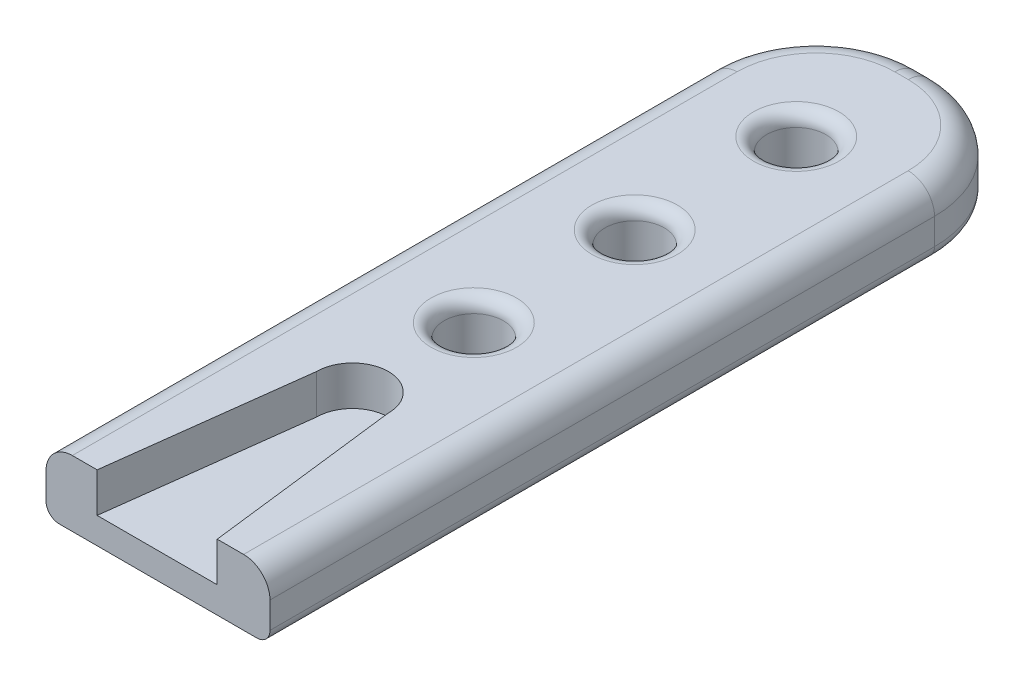
ISO-10303-21;
HEADER;
FILE_DESCRIPTION(('STEP AP214'),'2;1');
FILE_NAME('part.step','',(''),(''),'','','');
FILE_SCHEMA(('AUTOMOTIVE_DESIGN { 1 0 10303 214 1 1 1 1 }'));
ENDSEC;
DATA;
#1=APPLICATION_CONTEXT('core data for automotive mechanical design processes');
#2=APPLICATION_PROTOCOL_DEFINITION('international standard','automotive_design',2000,#1);
#3=PRODUCT_CONTEXT('',#1,'mechanical');
#4=PRODUCT('Part','Part','',(#3));
#5=PRODUCT_RELATED_PRODUCT_CATEGORY('part','',(#4));
#6=PRODUCT_DEFINITION_FORMATION('','',#4);
#7=PRODUCT_DEFINITION_CONTEXT('part definition',#1,'design');
#8=PRODUCT_DEFINITION('design','',#6,#7);
#9=PRODUCT_DEFINITION_SHAPE('','',#8);
#10=(LENGTH_UNIT() NAMED_UNIT(*) SI_UNIT(.MILLI.,.METRE.));
#11=(NAMED_UNIT(*) PLANE_ANGLE_UNIT() SI_UNIT($,.RADIAN.));
#12=(NAMED_UNIT(*) SI_UNIT($,.STERADIAN.) SOLID_ANGLE_UNIT());
#13=UNCERTAINTY_MEASURE_WITH_UNIT(LENGTH_MEASURE(1.E-05),#10,'distance_accuracy_value','');
#14=(GEOMETRIC_REPRESENTATION_CONTEXT(3) GLOBAL_UNCERTAINTY_ASSIGNED_CONTEXT((#13)) GLOBAL_UNIT_ASSIGNED_CONTEXT((#10,
#11,#12)) REPRESENTATION_CONTEXT('',''));
#15=CARTESIAN_POINT('',(0.,0.,0.));
#16=DIRECTION('',(0.,0.,1.));
#17=DIRECTION('',(1.,0.,0.));
#18=AXIS2_PLACEMENT_3D('',#15,#16,#17);
#19=CARTESIAN_POINT('',(-8.63704065750773,2.,0.));
#20=DIRECTION('',(1.,0.,0.));
#21=DIRECTION('',(0.,0.,-1.));
#22=AXIS2_PLACEMENT_3D('',#19,#20,#21);
#23=PLANE('',#22);
#24=DIRECTION('',(0.,-1.,0.));
#25=VECTOR('',#24,1.);
#26=CARTESIAN_POINT('',(-8.63704065750773,0.,-2.55421433247077));
#27=LINE('',#26,#25);
#28=CARTESIAN_POINT('',(-8.63704065750773,3.,-2.55421433247077));
#29=VERTEX_POINT('',#28);
#30=CARTESIAN_POINT('',(-8.63704065750773,1.,-2.55421433247077));
#31=VERTEX_POINT('',#30);
#32=EDGE_CURVE('E208',#29,#31,#27,.T.);
#33=ORIENTED_EDGE('',*,*,#32,.T.);
#34=DIRECTION('',(0.,0.,1.));
#35=VECTOR('',#34,1.);
#36=CARTESIAN_POINT('',(-8.63704065750773,1.,0.));
#37=LINE('',#36,#35);
#38=CARTESIAN_POINT('',(-8.63704065750773,1.,47.9450292444032));
#39=VERTEX_POINT('',#38);
#40=EDGE_CURVE('E288',#31,#39,#37,.T.);
#41=ORIENTED_EDGE('',*,*,#40,.T.);
#42=DIRECTION('',(0.,-1.,0.));
#43=VECTOR('',#42,1.);
#44=CARTESIAN_POINT('',(-8.63704065750773,2.,47.9450292444032));
#45=LINE('',#44,#43);
#46=CARTESIAN_POINT('',(-8.63704065750773,3.,47.9450292444032));
#47=VERTEX_POINT('',#46);
#48=EDGE_CURVE('E205',#47,#39,#45,.T.);
#49=ORIENTED_EDGE('',*,*,#48,.F.);
#50=DIRECTION('',(0.,0.,1.));
#51=VECTOR('',#50,1.);
#52=CARTESIAN_POINT('',(-8.63704065750773,3.,-2.55421433247077));
#53=LINE('',#52,#51);
#54=EDGE_CURVE('E242',#47,#29,#53,.F.);
#55=ORIENTED_EDGE('',*,*,#54,.T.);
#56=EDGE_LOOP('',(#33,#41,#49,#55));
#57=FACE_BOUND('',#56,.T.);
#58=ADVANCED_FACE('F35',(#57),#23,.F.);
#59=CARTESIAN_POINT('',(0.,2.,47.9450292444032));
#60=DIRECTION('',(0.,0.,-1.));
#61=DIRECTION('',(-1.,0.,0.));
#62=AXIS2_PLACEMENT_3D('',#59,#60,#61);
#63=PLANE('',#62);
#64=ORIENTED_EDGE('',*,*,#48,.T.);
#65=CARTESIAN_POINT('',(-7.63704065750773,1.,47.9450292444032));
#66=DIRECTION('',(0.,0.,-1.));
#67=DIRECTION('',(-1.,0.,0.));
#68=AXIS2_PLACEMENT_3D('',#65,#66,#67);
#69=CIRCLE('',#68,1.);
#70=CARTESIAN_POINT('',(-7.63704065750773,0.,47.9450292444032));
#71=VERTEX_POINT('',#70);
#72=EDGE_CURVE('E293',#39,#71,#69,.F.);
#73=ORIENTED_EDGE('',*,*,#72,.T.);
#74=DIRECTION('',(1.,0.,0.));
#75=VECTOR('',#74,1.);
#76=CARTESIAN_POINT('',(0.,0.,47.9450292444032));
#77=LINE('',#76,#75);
#78=CARTESIAN_POINT('',(7.38068932213508,0.,47.9450292444032));
#79=VERTEX_POINT('',#78);
#80=EDGE_CURVE('E198',#71,#79,#77,.T.);
#81=ORIENTED_EDGE('',*,*,#80,.T.);
#82=CARTESIAN_POINT('',(7.38068932213508,1.,47.9450292444032));
#83=DIRECTION('',(0.,0.,-1.));
#84=DIRECTION('',(-1.,0.,0.));
#85=AXIS2_PLACEMENT_3D('',#82,#83,#84);
#86=CIRCLE('',#85,1.);
#87=CARTESIAN_POINT('',(8.38068932213508,1.,47.9450292444032));
#88=VERTEX_POINT('',#87);
#89=EDGE_CURVE('E291',#79,#88,#86,.F.);
#90=ORIENTED_EDGE('',*,*,#89,.T.);
#91=DIRECTION('',(0.,-1.,0.));
#92=VECTOR('',#91,1.);
#93=CARTESIAN_POINT('',(8.38068932213508,2.,47.9450292444032));
#94=LINE('',#93,#92);
#95=CARTESIAN_POINT('',(8.38068932213508,3.,47.9450292444032));
#96=VERTEX_POINT('',#95);
#97=EDGE_CURVE('E201',#96,#88,#94,.T.);
#98=ORIENTED_EDGE('',*,*,#97,.F.);
#99=CARTESIAN_POINT('',(6.38068932213508,3.,47.9450292444032));
#100=DIRECTION('',(0.,0.,-1.));
#101=DIRECTION('',(-1.,0.,0.));
#102=AXIS2_PLACEMENT_3D('',#99,#100,#101);
#103=CIRCLE('',#102,2.);
#104=CARTESIAN_POINT('',(6.38068932213508,5.,47.9450292444032));
#105=VERTEX_POINT('',#104);
#106=EDGE_CURVE('E222',#96,#105,#103,.F.);
#107=ORIENTED_EDGE('',*,*,#106,.T.);
#108=DIRECTION('',(1.,0.,0.));
#109=VECTOR('',#108,1.);
#110=CARTESIAN_POINT('',(0.,5.,47.9450292444032));
#111=LINE('',#110,#109);
#112=CARTESIAN_POINT('',(4.37216869664136,5.,47.9450292444032));
#113=VERTEX_POINT('',#112);
#114=EDGE_CURVE('E184',#113,#105,#111,.T.);
#115=ORIENTED_EDGE('',*,*,#114,.F.);
#116=DIRECTION('',(0.,-1.,0.));
#117=VECTOR('',#116,1.);
#118=CARTESIAN_POINT('',(4.37216869664136,5.,47.9450292444032));
#119=LINE('',#118,#117);
#120=CARTESIAN_POINT('',(4.37216869664136,2.,47.9450292444032));
#121=VERTEX_POINT('',#120);
#122=EDGE_CURVE('E189',#113,#121,#119,.T.);
#123=ORIENTED_EDGE('',*,*,#122,.T.);
#124=DIRECTION('',(1.,0.,0.));
#125=VECTOR('',#124,1.);
#126=CARTESIAN_POINT('',(0.,2.,47.9450292444032));
#127=LINE('',#126,#125);
#128=CARTESIAN_POINT('',(-4.75197531295416,2.,47.9450292444032));
#129=VERTEX_POINT('',#128);
#130=EDGE_CURVE('E199',#129,#121,#127,.T.);
#131=ORIENTED_EDGE('',*,*,#130,.F.);
#132=DIRECTION('',(0.,-1.,0.));
#133=VECTOR('',#132,1.);
#134=CARTESIAN_POINT('',(-4.75197531295416,5.,47.9450292444032));
#135=LINE('',#134,#133);
#136=CARTESIAN_POINT('',(-4.75197531295416,5.,47.9450292444032));
#137=VERTEX_POINT('',#136);
#138=EDGE_CURVE('E187',#137,#129,#135,.T.);
#139=ORIENTED_EDGE('',*,*,#138,.F.);
#140=DIRECTION('',(1.,0.,0.));
#141=VECTOR('',#140,1.);
#142=CARTESIAN_POINT('',(0.,5.,47.9450292444032));
#143=LINE('',#142,#141);
#144=CARTESIAN_POINT('',(-6.63704065750773,5.,47.9450292444032));
#145=VERTEX_POINT('',#144);
#146=EDGE_CURVE('E175',#145,#137,#143,.T.);
#147=ORIENTED_EDGE('',*,*,#146,.F.);
#148=CARTESIAN_POINT('',(-6.63704065750773,3.,47.9450292444032));
#149=DIRECTION('',(0.,0.,-1.));
#150=DIRECTION('',(-1.,0.,0.));
#151=AXIS2_PLACEMENT_3D('',#148,#149,#150);
#152=CIRCLE('',#151,2.);
#153=EDGE_CURVE('E220',#145,#47,#152,.F.);
#154=ORIENTED_EDGE('',*,*,#153,.T.);
#155=EDGE_LOOP('',(#64,#73,#81,#90,#98,#107,#115,#123,#131,#139,#147,#154));
#156=FACE_BOUND('',#155,.T.);
#157=ADVANCED_FACE('F334',(#156),#63,.F.);
#158=CARTESIAN_POINT('',(8.38068932213508,2.,0.));
#159=DIRECTION('',(1.,0.,0.));
#160=DIRECTION('',(0.,0.,-1.));
#161=AXIS2_PLACEMENT_3D('',#158,#159,#160);
#162=PLANE('',#161);
#163=ORIENTED_EDGE('',*,*,#97,.T.);
#164=DIRECTION('',(0.,0.,1.));
#165=VECTOR('',#164,1.);
#166=CARTESIAN_POINT('',(8.38068932213508,1.,-2.55421433247077));
#167=LINE('',#166,#165);
#168=CARTESIAN_POINT('',(8.38068932213508,1.,-2.55421433247077));
#169=VERTEX_POINT('',#168);
#170=EDGE_CURVE('E11',#88,#169,#167,.F.);
#171=ORIENTED_EDGE('',*,*,#170,.T.);
#172=DIRECTION('',(0.,-1.,0.));
#173=VECTOR('',#172,1.);
#174=CARTESIAN_POINT('',(8.38068932213508,2.,-2.55421433247077));
#175=LINE('',#174,#173);
#176=CARTESIAN_POINT('',(8.38068932213508,3.,-2.55421433247077));
#177=VERTEX_POINT('',#176);
#178=EDGE_CURVE('E215',#169,#177,#175,.F.);
#179=ORIENTED_EDGE('',*,*,#178,.T.);
#180=DIRECTION('',(0.,0.,1.));
#181=VECTOR('',#180,1.);
#182=CARTESIAN_POINT('',(8.38068932213508,3.,0.));
#183=LINE('',#182,#181);
#184=EDGE_CURVE('E217',#177,#96,#183,.T.);
#185=ORIENTED_EDGE('',*,*,#184,.T.);
#186=EDGE_LOOP('',(#163,#171,#179,#185));
#187=FACE_BOUND('',#186,.T.);
#188=ADVANCED_FACE('F376',(#187),#162,.T.);
#189=CARTESIAN_POINT('',(-0.128409056114503,2.,11.7214834272454));
#190=DIRECTION('',(0.,-1.,0.));
#191=DIRECTION('',(0.,0.,-1.));
#192=AXIS2_PLACEMENT_3D('',#189,#190,#191);
#193=CYLINDRICAL_SURFACE('',#192,2.24999999887289);
#194=CARTESIAN_POINT('',(-0.128409056114503,1.,11.7214834272454));
#195=DIRECTION('',(0.,1.,0.));
#196=DIRECTION('',(0.,0.,1.));
#197=AXIS2_PLACEMENT_3D('',#194,#195,#196);
#198=CIRCLE('',#197,2.24999999887289);
#199=CARTESIAN_POINT('',(-0.128409056114503,1.,13.9714834261183));
#200=VERTEX_POINT('',#199);
#201=EDGE_CURVE('E270',#200,#200,#198,.F.);
#202=ORIENTED_EDGE('',*,*,#201,.T.);
#203=EDGE_LOOP('',(#202));
#204=FACE_BOUND('',#203,.T.);
#205=CARTESIAN_POINT('',(-0.128409056114503,4.,11.7214834272454));
#206=DIRECTION('',(0.,1.,0.));
#207=DIRECTION('',(0.,0.,1.));
#208=AXIS2_PLACEMENT_3D('',#205,#206,#207);
#209=CIRCLE('',#208,2.24999999887289);
#210=CARTESIAN_POINT('',(-0.128409056114503,4.,13.9714834261183));
#211=VERTEX_POINT('',#210);
#212=EDGE_CURVE('E267',#211,#211,#209,.T.);
#213=ORIENTED_EDGE('',*,*,#212,.T.);
#214=EDGE_LOOP('',(#213));
#215=FACE_BOUND('',#214,.T.);
#216=ADVANCED_FACE('F558',(#204,#215),#193,.F.);
#217=CARTESIAN_POINT('',(-0.1283831302215,2.,23.9474470096946));
#218=DIRECTION('',(0.,-1.,0.));
#219=DIRECTION('',(0.,0.,-1.));
#220=AXIS2_PLACEMENT_3D('',#217,#218,#219);
#221=CYLINDRICAL_SURFACE('',#220,2.25);
#222=CARTESIAN_POINT('',(-0.1283831302215,1.,23.9474470096946));
#223=DIRECTION('',(0.,1.,0.));
#224=DIRECTION('',(0.,0.,1.));
#225=AXIS2_PLACEMENT_3D('',#222,#223,#224);
#226=CIRCLE('',#225,2.25);
#227=CARTESIAN_POINT('',(-0.1283831302215,1.,26.1974470096946));
#228=VERTEX_POINT('',#227);
#229=EDGE_CURVE('E264',#228,#228,#226,.F.);
#230=ORIENTED_EDGE('',*,*,#229,.T.);
#231=EDGE_LOOP('',(#230));
#232=FACE_BOUND('',#231,.T.);
#233=CARTESIAN_POINT('',(-0.1283831302215,4.,23.9474470096946));
#234=DIRECTION('',(0.,1.,0.));
#235=DIRECTION('',(0.,0.,1.));
#236=AXIS2_PLACEMENT_3D('',#233,#234,#235);
#237=CIRCLE('',#236,2.25);
#238=CARTESIAN_POINT('',(-0.1283831302215,4.,26.1974470096946));
#239=VERTEX_POINT('',#238);
#240=EDGE_CURVE('E261',#239,#239,#237,.T.);
#241=ORIENTED_EDGE('',*,*,#240,.T.);
#242=EDGE_LOOP('',(#241));
#243=FACE_BOUND('',#242,.T.);
#244=ADVANCED_FACE('F546',(#232,#243),#221,.F.);
#245=CARTESIAN_POINT('',(0.,2.,-10.5542143324708));
#246=DIRECTION('',(0.,0.,-1.));
#247=DIRECTION('',(-1.,0.,0.));
#248=AXIS2_PLACEMENT_3D('',#245,#246,#247);
#249=PLANE('',#248);
#250=DIRECTION('',(0.,-1.,0.));
#251=VECTOR('',#250,1.);
#252=CARTESIAN_POINT('',(0.380689322135079,2.,-10.5542143324708));
#253=LINE('',#252,#251);
#254=CARTESIAN_POINT('',(0.380689322135079,3.,-10.5542143324708));
#255=VERTEX_POINT('',#254);
#256=CARTESIAN_POINT('',(0.380689322135079,1.,-10.5542143324708));
#257=VERTEX_POINT('',#256);
#258=EDGE_CURVE('E211',#255,#257,#253,.T.);
#259=ORIENTED_EDGE('',*,*,#258,.T.);
#260=DIRECTION('',(1.,0.,0.));
#261=VECTOR('',#260,1.);
#262=CARTESIAN_POINT('',(-0.637040657507733,1.,-10.5542143324708));
#263=LINE('',#262,#261);
#264=CARTESIAN_POINT('',(-0.637040657507733,1.,-10.5542143324708));
#265=VERTEX_POINT('',#264);
#266=EDGE_CURVE('E307',#257,#265,#263,.F.);
#267=ORIENTED_EDGE('',*,*,#266,.T.);
#268=DIRECTION('',(0.,-1.,0.));
#269=VECTOR('',#268,1.);
#270=CARTESIAN_POINT('',(-0.637040657507733,5.,-10.5542143324708));
#271=LINE('',#270,#269);
#272=CARTESIAN_POINT('',(-0.637040657507733,3.,-10.5542143324708));
#273=VERTEX_POINT('',#272);
#274=EDGE_CURVE('E213',#265,#273,#271,.F.);
#275=ORIENTED_EDGE('',*,*,#274,.T.);
#276=DIRECTION('',(1.,0.,0.));
#277=VECTOR('',#276,1.);
#278=CARTESIAN_POINT('',(0.,3.,-10.5542143324708));
#279=LINE('',#278,#277);
#280=EDGE_CURVE('E237',#273,#255,#279,.T.);
#281=ORIENTED_EDGE('',*,*,#280,.T.);
#282=EDGE_LOOP('',(#259,#267,#275,#281));
#283=FACE_BOUND('',#282,.T.);
#284=ADVANCED_FACE('F354',(#283),#249,.T.);
#285=CARTESIAN_POINT('',(-0.128292361900419,2.,-0.554214332238324));
#286=DIRECTION('',(0.,-1.,0.));
#287=DIRECTION('',(0.,0.,-1.));
#288=AXIS2_PLACEMENT_3D('',#285,#286,#287);
#289=CYLINDRICAL_SURFACE('',#288,2.25);
#290=CARTESIAN_POINT('',(-0.128292361900419,1.,-0.554214332238324));
#291=DIRECTION('',(0.,1.,0.));
#292=DIRECTION('',(0.,0.,1.));
#293=AXIS2_PLACEMENT_3D('',#290,#291,#292);
#294=CIRCLE('',#293,2.25);
#295=CARTESIAN_POINT('',(-0.128292361900419,1.,1.69578566776168));
#296=VERTEX_POINT('',#295);
#297=EDGE_CURVE('E276',#296,#296,#294,.F.);
#298=ORIENTED_EDGE('',*,*,#297,.T.);
#299=EDGE_LOOP('',(#298));
#300=FACE_BOUND('',#299,.T.);
#301=CARTESIAN_POINT('',(-0.128292361900419,4.,-0.554214332238324));
#302=DIRECTION('',(0.,1.,0.));
#303=DIRECTION('',(0.,0.,1.));
#304=AXIS2_PLACEMENT_3D('',#301,#302,#303);
#305=CIRCLE('',#304,2.25);
#306=CARTESIAN_POINT('',(-0.128292361900419,4.,1.69578566776168));
#307=VERTEX_POINT('',#306);
#308=EDGE_CURVE('E273',#307,#307,#305,.T.);
#309=ORIENTED_EDGE('',*,*,#308,.T.);
#310=EDGE_LOOP('',(#309));
#311=FACE_BOUND('',#310,.T.);
#312=ADVANCED_FACE('F383',(#300,#311),#289,.F.);
#313=CARTESIAN_POINT('',(0.,2.,0.));
#314=DIRECTION('',(0.,1.,0.));
#315=DIRECTION('',(0.,0.,1.));
#316=AXIS2_PLACEMENT_3D('',#313,#314,#315);
#317=PLANE('',#316);
#318=DIRECTION('',(0.124934588841006,0.,-0.992164980490205));
#319=VECTOR('',#318,1.);
#320=CARTESIAN_POINT('',(1.26525742098557,2.,0.15932271222752));
#321=LINE('',#320,#319);
#322=CARTESIAN_POINT('',(-2.88708064032051,2.,33.1350138303006));
#323=VERTEX_POINT('',#322);
#324=EDGE_CURVE('E157',#129,#323,#321,.T.);
#325=ORIENTED_EDGE('',*,*,#324,.F.);
#326=ORIENTED_EDGE('',*,*,#130,.T.);
#327=DIRECTION('',(0.120618857284149,0.,0.992698892548726));
#328=VECTOR('',#327,1.);
#329=CARTESIAN_POINT('',(-1.43229337725956,2.,0.174032218387131));
#330=LINE('',#329,#328);
#331=CARTESIAN_POINT('',(2.57347965168719,2.,33.1417334482974));
#332=VERTEX_POINT('',#331);
#333=EDGE_CURVE('E160',#332,#121,#330,.T.);
#334=ORIENTED_EDGE('',*,*,#333,.F.);
#335=CARTESIAN_POINT('',(-0.156800494316656,2.,33.138373639299));
#336=DIRECTION('',(0.,1.,0.));
#337=DIRECTION('',(0.,0.,1.));
#338=AXIS2_PLACEMENT_3D('',#335,#336,#337);
#339=CIRCLE('',#338,2.73028221324817);
#340=EDGE_CURVE('E195',#332,#323,#339,.T.);
#341=ORIENTED_EDGE('',*,*,#340,.T.);
#342=EDGE_LOOP('',(#325,#326,#334,#341));
#343=FACE_BOUND('',#342,.T.);
#344=ADVANCED_FACE('F381',(#343),#317,.T.);
#345=CARTESIAN_POINT('',(0.,0.,0.));
#346=DIRECTION('',(0.,1.,0.));
#347=DIRECTION('',(0.,0.,1.));
#348=AXIS2_PLACEMENT_3D('',#345,#346,#347);
#349=PLANE('',#348);
#350=CARTESIAN_POINT('',(-0.1283831302215,0.,23.9474470096946));
#351=DIRECTION('',(0.,1.,0.));
#352=DIRECTION('',(0.,0.,1.));
#353=AXIS2_PLACEMENT_3D('',#350,#351,#352);
#354=CIRCLE('',#353,3.25);
#355=CARTESIAN_POINT('',(-0.1283831302215,0.,27.1974470096946));
#356=VERTEX_POINT('',#355);
#357=EDGE_CURVE('E258',#356,#356,#354,.T.);
#358=ORIENTED_EDGE('',*,*,#357,.T.);
#359=EDGE_LOOP('',(#358));
#360=FACE_BOUND('',#359,.T.);
#361=CARTESIAN_POINT('',(-0.128409056114503,0.,11.7214834272454));
#362=DIRECTION('',(0.,1.,0.));
#363=DIRECTION('',(0.,0.,1.));
#364=AXIS2_PLACEMENT_3D('',#361,#362,#363);
#365=CIRCLE('',#364,3.24999999887289);
#366=CARTESIAN_POINT('',(-0.128409056114503,0.,14.9714834261183));
#367=VERTEX_POINT('',#366);
#368=EDGE_CURVE('E255',#367,#367,#365,.T.);
#369=ORIENTED_EDGE('',*,*,#368,.T.);
#370=EDGE_LOOP('',(#369));
#371=FACE_BOUND('',#370,.T.);
#372=CARTESIAN_POINT('',(-0.128292361900419,0.,-0.554214332238324));
#373=DIRECTION('',(0.,1.,0.));
#374=DIRECTION('',(0.,0.,1.));
#375=AXIS2_PLACEMENT_3D('',#372,#373,#374);
#376=CIRCLE('',#375,3.25);
#377=CARTESIAN_POINT('',(-0.128292361900419,0.,2.69578566776168));
#378=VERTEX_POINT('',#377);
#379=EDGE_CURVE('E244',#378,#378,#376,.T.);
#380=ORIENTED_EDGE('',*,*,#379,.T.);
#381=EDGE_LOOP('',(#380));
#382=FACE_BOUND('',#381,.T.);
#383=ORIENTED_EDGE('',*,*,#80,.F.);
#384=DIRECTION('',(0.,0.,1.));
#385=VECTOR('',#384,1.);
#386=CARTESIAN_POINT('',(-7.63704065750773,0.,0.));
#387=LINE('',#386,#385);
#388=CARTESIAN_POINT('',(-7.63704065750773,0.,-2.55421433247077));
#389=VERTEX_POINT('',#388);
#390=EDGE_CURVE('E303',#71,#389,#387,.F.);
#391=ORIENTED_EDGE('',*,*,#390,.T.);
#392=CARTESIAN_POINT('',(-0.637040657507733,0.,-2.55421433247077));
#393=DIRECTION('',(0.,1.,0.));
#394=DIRECTION('',(0.,0.,1.));
#395=AXIS2_PLACEMENT_3D('',#392,#393,#394);
#396=CIRCLE('',#395,7.);
#397=CARTESIAN_POINT('',(-0.637040657507733,0.,-9.55421433247077));
#398=VERTEX_POINT('',#397);
#399=EDGE_CURVE('E301',#389,#398,#396,.F.);
#400=ORIENTED_EDGE('',*,*,#399,.T.);
#401=DIRECTION('',(1.,0.,0.));
#402=VECTOR('',#401,1.);
#403=CARTESIAN_POINT('',(0.380689322135079,0.,-9.55421433247077));
#404=LINE('',#403,#402);
#405=CARTESIAN_POINT('',(0.380689322135079,0.,-9.55421433247077));
#406=VERTEX_POINT('',#405);
#407=EDGE_CURVE('E299',#398,#406,#404,.T.);
#408=ORIENTED_EDGE('',*,*,#407,.T.);
#409=CARTESIAN_POINT('',(0.380689322135079,0.,-2.55421433247077));
#410=DIRECTION('',(0.,1.,0.));
#411=DIRECTION('',(0.,0.,1.));
#412=AXIS2_PLACEMENT_3D('',#409,#410,#411);
#413=CIRCLE('',#412,7.);
#414=CARTESIAN_POINT('',(7.38068932213508,0.,-2.55421433247077));
#415=VERTEX_POINT('',#414);
#416=EDGE_CURVE('E297',#406,#415,#413,.F.);
#417=ORIENTED_EDGE('',*,*,#416,.T.);
#418=DIRECTION('',(0.,0.,1.));
#419=VECTOR('',#418,1.);
#420=CARTESIAN_POINT('',(7.38068932213508,0.,47.9450292444032));
#421=LINE('',#420,#419);
#422=EDGE_CURVE('E295',#415,#79,#421,.T.);
#423=ORIENTED_EDGE('',*,*,#422,.T.);
#424=EDGE_LOOP('',(#383,#391,#400,#408,#417,#423));
#425=FACE_BOUND('',#424,.T.);
#426=ADVANCED_FACE('F331',(#360,#371,#382,#425),#349,.F.);
#427=CARTESIAN_POINT('',(1.26525742098557,5.,0.15932271222752));
#428=DIRECTION('',(0.992164980490205,0.,0.124934588841006));
#429=DIRECTION('',(0.124934588841006,0.,-0.992164980490205));
#430=AXIS2_PLACEMENT_3D('',#427,#428,#429);
#431=PLANE('',#430);
#432=ORIENTED_EDGE('',*,*,#138,.T.);
#433=ORIENTED_EDGE('',*,*,#324,.T.);
#434=DIRECTION('',(0.,-1.,0.));
#435=VECTOR('',#434,1.);
#436=CARTESIAN_POINT('',(-2.88708064032051,5.,33.1350138303006));
#437=LINE('',#436,#435);
#438=CARTESIAN_POINT('',(-2.88708064032051,5.,33.1350138303006));
#439=VERTEX_POINT('',#438);
#440=EDGE_CURVE('E150',#439,#323,#437,.T.);
#441=ORIENTED_EDGE('',*,*,#440,.F.);
#442=DIRECTION('',(-0.124934588841006,0.,0.992164980490205));
#443=VECTOR('',#442,1.);
#444=CARTESIAN_POINT('',(1.26525742098557,5.,0.15932271222752));
#445=LINE('',#444,#443);
#446=EDGE_CURVE('E155',#439,#137,#445,.T.);
#447=ORIENTED_EDGE('',*,*,#446,.T.);
#448=EDGE_LOOP('',(#432,#433,#441,#447));
#449=FACE_BOUND('',#448,.T.);
#450=ADVANCED_FACE('F153',(#449),#431,.T.);
#451=CARTESIAN_POINT('',(-0.156800494316656,5.,33.138373639299));
#452=DIRECTION('',(0.,-1.,0.));
#453=DIRECTION('',(0.,0.,-1.));
#454=AXIS2_PLACEMENT_3D('',#451,#452,#453);
#455=CYLINDRICAL_SURFACE('',#454,2.73028221324817);
#456=ORIENTED_EDGE('',*,*,#340,.F.);
#457=DIRECTION('',(0.,-1.,0.));
#458=VECTOR('',#457,1.);
#459=CARTESIAN_POINT('',(2.57347965168719,5.,33.1417334482974));
#460=LINE('',#459,#458);
#461=CARTESIAN_POINT('',(2.57347965168719,5.,33.1417334482974));
#462=VERTEX_POINT('',#461);
#463=EDGE_CURVE('E161',#462,#332,#460,.T.);
#464=ORIENTED_EDGE('',*,*,#463,.F.);
#465=CARTESIAN_POINT('',(-0.156800494316656,5.,33.138373639299));
#466=DIRECTION('',(0.,1.,0.));
#467=DIRECTION('',(0.,0.,1.));
#468=AXIS2_PLACEMENT_3D('',#465,#466,#467);
#469=CIRCLE('',#468,2.73028221324817);
#470=EDGE_CURVE('E164',#439,#462,#469,.F.);
#471=ORIENTED_EDGE('',*,*,#470,.F.);
#472=ORIENTED_EDGE('',*,*,#440,.T.);
#473=EDGE_LOOP('',(#456,#464,#471,#472));
#474=FACE_BOUND('',#473,.T.);
#475=ADVANCED_FACE('F165',(#474),#455,.F.);
#476=CARTESIAN_POINT('',(-1.43229337725956,5.,0.174032218387131));
#477=DIRECTION('',(-0.992698892548726,0.,0.120618857284149));
#478=DIRECTION('',(0.120618857284149,0.,0.992698892548726));
#479=AXIS2_PLACEMENT_3D('',#476,#477,#478);
#480=PLANE('',#479);
#481=ORIENTED_EDGE('',*,*,#463,.T.);
#482=ORIENTED_EDGE('',*,*,#333,.T.);
#483=ORIENTED_EDGE('',*,*,#122,.F.);
#484=DIRECTION('',(-0.120618857284149,0.,-0.992698892548726));
#485=VECTOR('',#484,1.);
#486=CARTESIAN_POINT('',(-1.43229337725956,5.,0.174032218387131));
#487=LINE('',#486,#485);
#488=EDGE_CURVE('E170',#113,#462,#487,.T.);
#489=ORIENTED_EDGE('',*,*,#488,.T.);
#490=EDGE_LOOP('',(#481,#482,#483,#489));
#491=FACE_BOUND('',#490,.T.);
#492=ADVANCED_FACE('F379',(#491),#480,.T.);
#493=CARTESIAN_POINT('',(0.,5.,0.));
#494=DIRECTION('',(0.,1.,0.));
#495=DIRECTION('',(0.,0.,1.));
#496=AXIS2_PLACEMENT_3D('',#493,#494,#495);
#497=PLANE('',#496);
#498=CARTESIAN_POINT('',(-0.128292361900419,5.,-0.554214332238324));
#499=DIRECTION('',(0.,1.,0.));
#500=DIRECTION('',(0.,0.,1.));
#501=AXIS2_PLACEMENT_3D('',#498,#499,#500);
#502=CIRCLE('',#501,3.25);
#503=CARTESIAN_POINT('',(-0.128292361900419,5.,2.69578566776168));
#504=VERTEX_POINT('',#503);
#505=EDGE_CURVE('E285',#504,#504,#502,.F.);
#506=ORIENTED_EDGE('',*,*,#505,.T.);
#507=EDGE_LOOP('',(#506));
#508=FACE_BOUND('',#507,.T.);
#509=CARTESIAN_POINT('',(-0.128409056114503,5.,11.7214834272454));
#510=DIRECTION('',(0.,1.,0.));
#511=DIRECTION('',(0.,0.,1.));
#512=AXIS2_PLACEMENT_3D('',#509,#510,#511);
#513=CIRCLE('',#512,3.24999999887289);
#514=CARTESIAN_POINT('',(-0.128409056114503,5.,14.9714834261183));
#515=VERTEX_POINT('',#514);
#516=EDGE_CURVE('E282',#515,#515,#513,.F.);
#517=ORIENTED_EDGE('',*,*,#516,.T.);
#518=EDGE_LOOP('',(#517));
#519=FACE_BOUND('',#518,.T.);
#520=CARTESIAN_POINT('',(-0.1283831302215,5.,23.9474470096946));
#521=DIRECTION('',(0.,1.,0.));
#522=DIRECTION('',(0.,0.,1.));
#523=AXIS2_PLACEMENT_3D('',#520,#521,#522);
#524=CIRCLE('',#523,3.25);
#525=CARTESIAN_POINT('',(-0.1283831302215,5.,27.1974470096946));
#526=VERTEX_POINT('',#525);
#527=EDGE_CURVE('E279',#526,#526,#524,.F.);
#528=ORIENTED_EDGE('',*,*,#527,.T.);
#529=EDGE_LOOP('',(#528));
#530=FACE_BOUND('',#529,.T.);
#531=ORIENTED_EDGE('',*,*,#114,.T.);
#532=DIRECTION('',(0.,0.,1.));
#533=VECTOR('',#532,1.);
#534=CARTESIAN_POINT('',(6.38068932213508,5.,0.));
#535=LINE('',#534,#533);
#536=CARTESIAN_POINT('',(6.38068932213508,5.,-2.55421433247077));
#537=VERTEX_POINT('',#536);
#538=EDGE_CURVE('E232',#105,#537,#535,.F.);
#539=ORIENTED_EDGE('',*,*,#538,.T.);
#540=CARTESIAN_POINT('',(0.380689322135079,5.,-2.55421433247077));
#541=DIRECTION('',(0.,1.,0.));
#542=DIRECTION('',(0.,0.,1.));
#543=AXIS2_PLACEMENT_3D('',#540,#541,#542);
#544=CIRCLE('',#543,6.);
#545=CARTESIAN_POINT('',(0.380689322135079,5.,-8.55421433247077));
#546=VERTEX_POINT('',#545);
#547=EDGE_CURVE('E230',#537,#546,#544,.T.);
#548=ORIENTED_EDGE('',*,*,#547,.T.);
#549=DIRECTION('',(1.,0.,0.));
#550=VECTOR('',#549,1.);
#551=CARTESIAN_POINT('',(0.,5.,-8.55421433247077));
#552=LINE('',#551,#550);
#553=CARTESIAN_POINT('',(-0.637040657507733,5.,-8.55421433247077));
#554=VERTEX_POINT('',#553);
#555=EDGE_CURVE('E228',#546,#554,#552,.F.);
#556=ORIENTED_EDGE('',*,*,#555,.T.);
#557=CARTESIAN_POINT('',(-0.637040657507733,5.,-2.55421433247077));
#558=DIRECTION('',(0.,1.,0.));
#559=DIRECTION('',(0.,0.,1.));
#560=AXIS2_PLACEMENT_3D('',#557,#558,#559);
#561=CIRCLE('',#560,6.);
#562=CARTESIAN_POINT('',(-6.63704065750773,5.,-2.55421433247077));
#563=VERTEX_POINT('',#562);
#564=EDGE_CURVE('E226',#554,#563,#561,.T.);
#565=ORIENTED_EDGE('',*,*,#564,.T.);
#566=DIRECTION('',(0.,0.,1.));
#567=VECTOR('',#566,1.);
#568=CARTESIAN_POINT('',(-6.63704065750773,5.,47.9450292444032));
#569=LINE('',#568,#567);
#570=EDGE_CURVE('E224',#563,#145,#569,.T.);
#571=ORIENTED_EDGE('',*,*,#570,.T.);
#572=ORIENTED_EDGE('',*,*,#146,.T.);
#573=ORIENTED_EDGE('',*,*,#446,.F.);
#574=ORIENTED_EDGE('',*,*,#470,.T.);
#575=ORIENTED_EDGE('',*,*,#488,.F.);
#576=EDGE_LOOP('',(#531,#539,#548,#556,#565,#571,#572,#573,#574,#575));
#577=FACE_BOUND('',#576,.T.);
#578=ADVANCED_FACE('F173',(#508,#519,#530,#577),#497,.T.);
#579=CARTESIAN_POINT('',(-0.637040657507733,2.,-2.55421433247077));
#580=DIRECTION('',(0.,1.,0.));
#581=DIRECTION('',(0.,0.,1.));
#582=AXIS2_PLACEMENT_3D('',#579,#580,#581);
#583=CYLINDRICAL_SURFACE('',#582,8.);
#584=ORIENTED_EDGE('',*,*,#274,.F.);
#585=CARTESIAN_POINT('',(-0.637040657507733,1.,-2.55421433247077));
#586=DIRECTION('',(0.,1.,0.));
#587=DIRECTION('',(0.,0.,1.));
#588=AXIS2_PLACEMENT_3D('',#585,#586,#587);
#589=CIRCLE('',#588,8.);
#590=EDGE_CURVE('E305',#265,#31,#589,.T.);
#591=ORIENTED_EDGE('',*,*,#590,.T.);
#592=ORIENTED_EDGE('',*,*,#32,.F.);
#593=CARTESIAN_POINT('',(-0.637040657507733,3.,-2.55421433247077));
#594=DIRECTION('',(0.,1.,0.));
#595=DIRECTION('',(0.,0.,1.));
#596=AXIS2_PLACEMENT_3D('',#593,#594,#595);
#597=CIRCLE('',#596,8.);
#598=EDGE_CURVE('E239',#29,#273,#597,.F.);
#599=ORIENTED_EDGE('',*,*,#598,.T.);
#600=EDGE_LOOP('',(#584,#591,#592,#599));
#601=FACE_BOUND('',#600,.T.);
#602=ADVANCED_FACE('F355',(#601),#583,.T.);
#603=CARTESIAN_POINT('',(0.380689322135079,2.,-2.55421433247077));
#604=DIRECTION('',(0.,-1.,0.));
#605=DIRECTION('',(0.,0.,-1.));
#606=AXIS2_PLACEMENT_3D('',#603,#604,#605);
#607=CYLINDRICAL_SURFACE('',#606,8.);
#608=ORIENTED_EDGE('',*,*,#178,.F.);
#609=CARTESIAN_POINT('',(0.380689322135079,1.,-2.55421433247077));
#610=DIRECTION('',(0.,1.,0.));
#611=DIRECTION('',(0.,0.,1.));
#612=AXIS2_PLACEMENT_3D('',#609,#610,#611);
#613=CIRCLE('',#612,8.);
#614=EDGE_CURVE('E44',#169,#257,#613,.T.);
#615=ORIENTED_EDGE('',*,*,#614,.T.);
#616=ORIENTED_EDGE('',*,*,#258,.F.);
#617=CARTESIAN_POINT('',(0.380689322135079,3.,-2.55421433247077));
#618=DIRECTION('',(0.,1.,0.));
#619=DIRECTION('',(0.,0.,1.));
#620=AXIS2_PLACEMENT_3D('',#617,#618,#619);
#621=CIRCLE('',#620,8.);
#622=EDGE_CURVE('E234',#255,#177,#621,.F.);
#623=ORIENTED_EDGE('',*,*,#622,.T.);
#624=EDGE_LOOP('',(#608,#615,#616,#623));
#625=FACE_BOUND('',#624,.T.);
#626=ADVANCED_FACE('F367',(#625),#607,.T.);
#627=CARTESIAN_POINT('',(-6.63704065750773,3.,0.));
#628=DIRECTION('',(0.,0.,-1.));
#629=DIRECTION('',(-1.,0.,0.));
#630=AXIS2_PLACEMENT_3D('',#627,#628,#629);
#631=CYLINDRICAL_SURFACE('',#630,2.);
#632=ORIENTED_EDGE('',*,*,#153,.F.);
#633=ORIENTED_EDGE('',*,*,#570,.F.);
#634=CARTESIAN_POINT('',(-6.63704065750773,3.,-2.55421433247077));
#635=DIRECTION('',(0.,0.,-1.));
#636=DIRECTION('',(-1.,0.,0.));
#637=AXIS2_PLACEMENT_3D('',#634,#635,#636);
#638=CIRCLE('',#637,2.);
#639=EDGE_CURVE('E177',#29,#563,#638,.T.);
#640=ORIENTED_EDGE('',*,*,#639,.F.);
#641=ORIENTED_EDGE('',*,*,#54,.F.);
#642=EDGE_LOOP('',(#632,#633,#640,#641));
#643=FACE_BOUND('',#642,.T.);
#644=ADVANCED_FACE('F406',(#643),#631,.T.);
#645=CARTESIAN_POINT('',(-0.637040657507733,3.,-2.55421433247077));
#646=DIRECTION('',(0.,1.,0.));
#647=DIRECTION('',(0.,0.,1.));
#648=AXIS2_PLACEMENT_3D('',#645,#646,#647);
#649=TOROIDAL_SURFACE('',#648,6.,2.);
#650=ORIENTED_EDGE('',*,*,#639,.T.);
#651=ORIENTED_EDGE('',*,*,#564,.F.);
#652=CARTESIAN_POINT('',(-0.637040657507733,3.,-8.55421433247077));
#653=DIRECTION('',(1.,0.,0.));
#654=DIRECTION('',(0.,0.,-1.));
#655=AXIS2_PLACEMENT_3D('',#652,#653,#654);
#656=CIRCLE('',#655,2.);
#657=EDGE_CURVE('E180',#273,#554,#656,.T.);
#658=ORIENTED_EDGE('',*,*,#657,.F.);
#659=ORIENTED_EDGE('',*,*,#598,.F.);
#660=EDGE_LOOP('',(#650,#651,#658,#659));
#661=FACE_BOUND('',#660,.T.);
#662=ADVANCED_FACE('F361',(#661),#649,.T.);
#663=CARTESIAN_POINT('',(0.,3.,-8.55421433247077));
#664=DIRECTION('',(1.,0.,0.));
#665=DIRECTION('',(0.,0.,-1.));
#666=AXIS2_PLACEMENT_3D('',#663,#664,#665);
#667=CYLINDRICAL_SURFACE('',#666,2.);
#668=ORIENTED_EDGE('',*,*,#657,.T.);
#669=ORIENTED_EDGE('',*,*,#555,.F.);
#670=CARTESIAN_POINT('',(0.380689322135079,3.,-8.55421433247077));
#671=DIRECTION('',(1.,0.,0.));
#672=DIRECTION('',(0.,0.,-1.));
#673=AXIS2_PLACEMENT_3D('',#670,#671,#672);
#674=CIRCLE('',#673,2.);
#675=EDGE_CURVE('E248',#255,#546,#674,.T.);
#676=ORIENTED_EDGE('',*,*,#675,.F.);
#677=ORIENTED_EDGE('',*,*,#280,.F.);
#678=EDGE_LOOP('',(#668,#669,#676,#677));
#679=FACE_BOUND('',#678,.T.);
#680=ADVANCED_FACE('F365',(#679),#667,.T.);
#681=CARTESIAN_POINT('',(0.380689322135079,3.,-2.55421433247077));
#682=DIRECTION('',(0.,1.,0.));
#683=DIRECTION('',(0.,0.,1.));
#684=AXIS2_PLACEMENT_3D('',#681,#682,#683);
#685=TOROIDAL_SURFACE('',#684,6.,2.);
#686=ORIENTED_EDGE('',*,*,#675,.T.);
#687=ORIENTED_EDGE('',*,*,#547,.F.);
#688=CARTESIAN_POINT('',(6.38068932213508,3.,-2.55421433247077));
#689=DIRECTION('',(0.,0.,1.));
#690=DIRECTION('',(1.,0.,0.));
#691=AXIS2_PLACEMENT_3D('',#688,#689,#690);
#692=CIRCLE('',#691,2.);
#693=EDGE_CURVE('E245',#177,#537,#692,.T.);
#694=ORIENTED_EDGE('',*,*,#693,.F.);
#695=ORIENTED_EDGE('',*,*,#622,.F.);
#696=EDGE_LOOP('',(#686,#687,#694,#695));
#697=FACE_BOUND('',#696,.T.);
#698=ADVANCED_FACE('F372',(#697),#685,.T.);
#699=CARTESIAN_POINT('',(6.38068932213508,3.,0.));
#700=DIRECTION('',(0.,0.,1.));
#701=DIRECTION('',(1.,0.,0.));
#702=AXIS2_PLACEMENT_3D('',#699,#700,#701);
#703=CYLINDRICAL_SURFACE('',#702,2.);
#704=ORIENTED_EDGE('',*,*,#693,.T.);
#705=ORIENTED_EDGE('',*,*,#538,.F.);
#706=ORIENTED_EDGE('',*,*,#106,.F.);
#707=ORIENTED_EDGE('',*,*,#184,.F.);
#708=EDGE_LOOP('',(#704,#705,#706,#707));
#709=FACE_BOUND('',#708,.T.);
#710=ADVANCED_FACE('F375',(#709),#703,.T.);
#711=CARTESIAN_POINT('',(-0.1283831302215,1.,23.9474470096946));
#712=DIRECTION('',(0.,1.,0.));
#713=DIRECTION('',(0.,0.,1.));
#714=AXIS2_PLACEMENT_3D('',#711,#712,#713);
#715=TOROIDAL_SURFACE('',#714,3.25,1.);
#716=ORIENTED_EDGE('',*,*,#229,.F.);
#717=EDGE_LOOP('',(#716));
#718=FACE_BOUND('',#717,.T.);
#719=ORIENTED_EDGE('',*,*,#357,.F.);
#720=EDGE_LOOP('',(#719));
#721=FACE_BOUND('',#720,.T.);
#722=ADVANCED_FACE('F409',(#718,#721),#715,.T.);
#723=CARTESIAN_POINT('',(-0.128409056114503,1.,11.7214834272454));
#724=DIRECTION('',(0.,1.,0.));
#725=DIRECTION('',(0.,0.,1.));
#726=AXIS2_PLACEMENT_3D('',#723,#724,#725);
#727=TOROIDAL_SURFACE('',#726,3.24999999887289,1.);
#728=ORIENTED_EDGE('',*,*,#201,.F.);
#729=EDGE_LOOP('',(#728));
#730=FACE_BOUND('',#729,.T.);
#731=ORIENTED_EDGE('',*,*,#368,.F.);
#732=EDGE_LOOP('',(#731));
#733=FACE_BOUND('',#732,.T.);
#734=ADVANCED_FACE('F421',(#730,#733),#727,.T.);
#735=CARTESIAN_POINT('',(-0.128292361900419,1.,-0.554214332238324));
#736=DIRECTION('',(0.,1.,0.));
#737=DIRECTION('',(0.,0.,1.));
#738=AXIS2_PLACEMENT_3D('',#735,#736,#737);
#739=TOROIDAL_SURFACE('',#738,3.25,1.);
#740=ORIENTED_EDGE('',*,*,#297,.F.);
#741=EDGE_LOOP('',(#740));
#742=FACE_BOUND('',#741,.T.);
#743=ORIENTED_EDGE('',*,*,#379,.F.);
#744=EDGE_LOOP('',(#743));
#745=FACE_BOUND('',#744,.T.);
#746=ADVANCED_FACE('F425',(#742,#745),#739,.T.);
#747=CARTESIAN_POINT('',(-0.128292361900419,4.,-0.554214332238324));
#748=DIRECTION('',(0.,1.,0.));
#749=DIRECTION('',(0.,0.,1.));
#750=AXIS2_PLACEMENT_3D('',#747,#748,#749);
#751=TOROIDAL_SURFACE('',#750,3.25,1.);
#752=ORIENTED_EDGE('',*,*,#505,.F.);
#753=EDGE_LOOP('',(#752));
#754=FACE_BOUND('',#753,.T.);
#755=ORIENTED_EDGE('',*,*,#308,.F.);
#756=EDGE_LOOP('',(#755));
#757=FACE_BOUND('',#756,.T.);
#758=ADVANCED_FACE('F429',(#754,#757),#751,.T.);
#759=CARTESIAN_POINT('',(-0.128409056114503,4.,11.7214834272454));
#760=DIRECTION('',(0.,1.,0.));
#761=DIRECTION('',(0.,0.,1.));
#762=AXIS2_PLACEMENT_3D('',#759,#760,#761);
#763=TOROIDAL_SURFACE('',#762,3.24999999887289,1.);
#764=ORIENTED_EDGE('',*,*,#516,.F.);
#765=EDGE_LOOP('',(#764));
#766=FACE_BOUND('',#765,.T.);
#767=ORIENTED_EDGE('',*,*,#212,.F.);
#768=EDGE_LOOP('',(#767));
#769=FACE_BOUND('',#768,.T.);
#770=ADVANCED_FACE('F433',(#766,#769),#763,.T.);
#771=CARTESIAN_POINT('',(-0.1283831302215,4.,23.9474470096946));
#772=DIRECTION('',(0.,1.,0.));
#773=DIRECTION('',(0.,0.,1.));
#774=AXIS2_PLACEMENT_3D('',#771,#772,#773);
#775=TOROIDAL_SURFACE('',#774,3.25,1.);
#776=ORIENTED_EDGE('',*,*,#527,.F.);
#777=EDGE_LOOP('',(#776));
#778=FACE_BOUND('',#777,.T.);
#779=ORIENTED_EDGE('',*,*,#240,.F.);
#780=EDGE_LOOP('',(#779));
#781=FACE_BOUND('',#780,.T.);
#782=ADVANCED_FACE('F437',(#778,#781),#775,.T.);
#783=CARTESIAN_POINT('',(7.38068932213508,1.,0.));
#784=DIRECTION('',(0.,0.,-1.));
#785=DIRECTION('',(-1.,0.,0.));
#786=AXIS2_PLACEMENT_3D('',#783,#784,#785);
#787=CYLINDRICAL_SURFACE('',#786,1.);
#788=ORIENTED_EDGE('',*,*,#89,.F.);
#789=ORIENTED_EDGE('',*,*,#422,.F.);
#790=CARTESIAN_POINT('',(7.38068932213508,1.,-2.55421433247077));
#791=DIRECTION('',(0.,0.,-1.));
#792=DIRECTION('',(-1.,0.,0.));
#793=AXIS2_PLACEMENT_3D('',#790,#791,#792);
#794=CIRCLE('',#793,1.);
#795=EDGE_CURVE('E39',#169,#415,#794,.T.);
#796=ORIENTED_EDGE('',*,*,#795,.F.);
#797=ORIENTED_EDGE('',*,*,#170,.F.);
#798=EDGE_LOOP('',(#788,#789,#796,#797));
#799=FACE_BOUND('',#798,.T.);
#800=ADVANCED_FACE('F37',(#799),#787,.T.);
#801=CARTESIAN_POINT('',(0.380689322135079,1.,-2.55421433247077));
#802=DIRECTION('',(0.,1.,0.));
#803=DIRECTION('',(0.,0.,1.));
#804=AXIS2_PLACEMENT_3D('',#801,#802,#803);
#805=TOROIDAL_SURFACE('',#804,7.,1.);
#806=ORIENTED_EDGE('',*,*,#795,.T.);
#807=ORIENTED_EDGE('',*,*,#416,.F.);
#808=CARTESIAN_POINT('',(0.380689322135079,1.,-9.55421433247077));
#809=DIRECTION('',(-1.,0.,0.));
#810=DIRECTION('',(0.,0.,1.));
#811=AXIS2_PLACEMENT_3D('',#808,#809,#810);
#812=CIRCLE('',#811,1.);
#813=EDGE_CURVE('E315',#257,#406,#812,.T.);
#814=ORIENTED_EDGE('',*,*,#813,.F.);
#815=ORIENTED_EDGE('',*,*,#614,.F.);
#816=EDGE_LOOP('',(#806,#807,#814,#815));
#817=FACE_BOUND('',#816,.T.);
#818=ADVANCED_FACE('F325',(#817),#805,.T.);
#819=CARTESIAN_POINT('',(0.,1.,-9.55421433247077));
#820=DIRECTION('',(-1.,0.,0.));
#821=DIRECTION('',(0.,0.,1.));
#822=AXIS2_PLACEMENT_3D('',#819,#820,#821);
#823=CYLINDRICAL_SURFACE('',#822,1.);
#824=ORIENTED_EDGE('',*,*,#813,.T.);
#825=ORIENTED_EDGE('',*,*,#407,.F.);
#826=CARTESIAN_POINT('',(-0.637040657507733,1.,-9.55421433247077));
#827=DIRECTION('',(-1.,0.,0.));
#828=DIRECTION('',(0.,0.,1.));
#829=AXIS2_PLACEMENT_3D('',#826,#827,#828);
#830=CIRCLE('',#829,1.);
#831=EDGE_CURVE('E313',#265,#398,#830,.T.);
#832=ORIENTED_EDGE('',*,*,#831,.F.);
#833=ORIENTED_EDGE('',*,*,#266,.F.);
#834=EDGE_LOOP('',(#824,#825,#832,#833));
#835=FACE_BOUND('',#834,.T.);
#836=ADVANCED_FACE('F351',(#835),#823,.T.);
#837=CARTESIAN_POINT('',(-0.637040657507733,1.,-2.55421433247077));
#838=DIRECTION('',(0.,1.,0.));
#839=DIRECTION('',(0.,0.,1.));
#840=AXIS2_PLACEMENT_3D('',#837,#838,#839);
#841=TOROIDAL_SURFACE('',#840,7.,1.);
#842=ORIENTED_EDGE('',*,*,#831,.T.);
#843=ORIENTED_EDGE('',*,*,#399,.F.);
#844=CARTESIAN_POINT('',(-7.63704065750773,1.,-2.55421433247077));
#845=DIRECTION('',(0.,0.,1.));
#846=DIRECTION('',(1.,0.,0.));
#847=AXIS2_PLACEMENT_3D('',#844,#845,#846);
#848=CIRCLE('',#847,1.);
#849=EDGE_CURVE('E310',#31,#389,#848,.T.);
#850=ORIENTED_EDGE('',*,*,#849,.F.);
#851=ORIENTED_EDGE('',*,*,#590,.F.);
#852=EDGE_LOOP('',(#842,#843,#850,#851));
#853=FACE_BOUND('',#852,.T.);
#854=ADVANCED_FACE('F349',(#853),#841,.T.);
#855=CARTESIAN_POINT('',(-7.63704065750773,1.,0.));
#856=DIRECTION('',(0.,0.,1.));
#857=DIRECTION('',(1.,0.,0.));
#858=AXIS2_PLACEMENT_3D('',#855,#856,#857);
#859=CYLINDRICAL_SURFACE('',#858,1.);
#860=ORIENTED_EDGE('',*,*,#849,.T.);
#861=ORIENTED_EDGE('',*,*,#390,.F.);
#862=ORIENTED_EDGE('',*,*,#72,.F.);
#863=ORIENTED_EDGE('',*,*,#40,.F.);
#864=EDGE_LOOP('',(#860,#861,#862,#863));
#865=FACE_BOUND('',#864,.T.);
#866=ADVANCED_FACE('F339',(#865),#859,.T.);
#867=CLOSED_SHELL('',(#58,#157,#188,#216,#244,#284,#312,#344,#426,#450,#475,#492,#578,#602,#626,
#644,#662,#680,#698,#710,#722,#734,#746,#758,#770,#782,#800,#818,#836,#854,#866));
#868=MANIFOLD_SOLID_BREP('B2',#867);
#869=ADVANCED_BREP_SHAPE_REPRESENTATION('',(#18,#868),#14);
#870=SHAPE_DEFINITION_REPRESENTATION(#9,#869);
ENDSEC;
END-ISO-10303-21;
